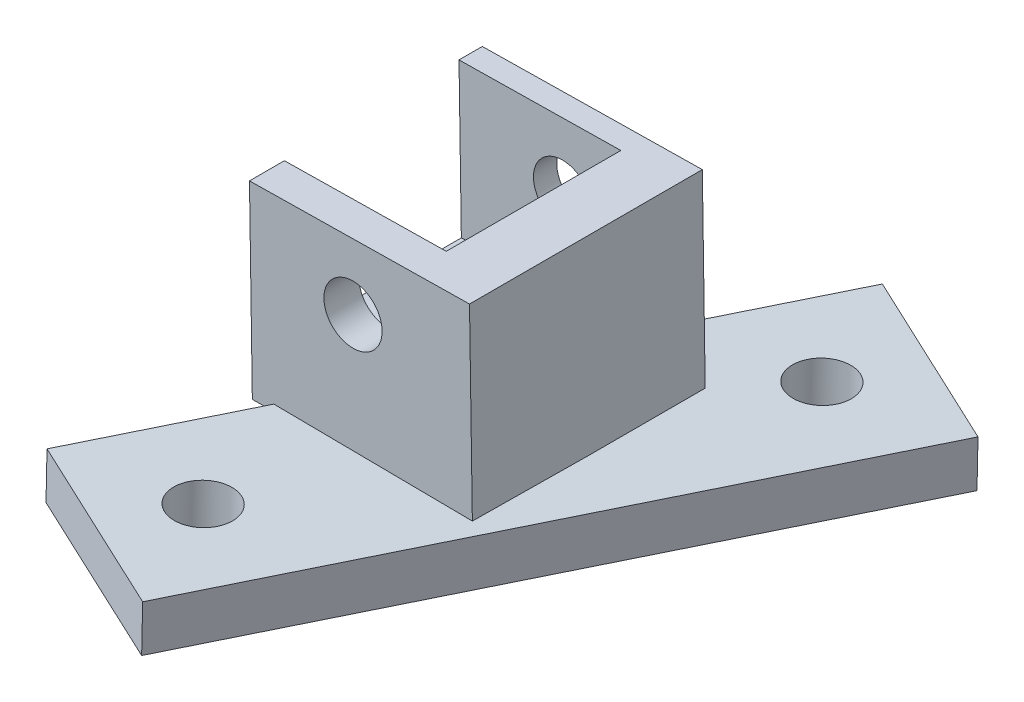
ISO-10303-21;
HEADER;
FILE_DESCRIPTION(('STEP AP214'),'2;1');
FILE_NAME('part.step','',(''),(''),'','','');
FILE_SCHEMA(('AUTOMOTIVE_DESIGN { 1 0 10303 214 1 1 1 1 }'));
ENDSEC;
DATA;
#1=APPLICATION_CONTEXT('core data for automotive mechanical design processes');
#2=APPLICATION_PROTOCOL_DEFINITION('international standard','automotive_design',2000,#1);
#3=PRODUCT_CONTEXT('',#1,'mechanical');
#4=PRODUCT('Part','Part','',(#3));
#5=PRODUCT_RELATED_PRODUCT_CATEGORY('part','',(#4));
#6=PRODUCT_DEFINITION_FORMATION('','',#4);
#7=PRODUCT_DEFINITION_CONTEXT('part definition',#1,'design');
#8=PRODUCT_DEFINITION('design','',#6,#7);
#9=PRODUCT_DEFINITION_SHAPE('','',#8);
#10=(LENGTH_UNIT() NAMED_UNIT(*) SI_UNIT(.MILLI.,.METRE.));
#11=(NAMED_UNIT(*) PLANE_ANGLE_UNIT() SI_UNIT($,.RADIAN.));
#12=(NAMED_UNIT(*) SI_UNIT($,.STERADIAN.) SOLID_ANGLE_UNIT());
#13=UNCERTAINTY_MEASURE_WITH_UNIT(LENGTH_MEASURE(1.E-05),#10,'distance_accuracy_value','');
#14=(GEOMETRIC_REPRESENTATION_CONTEXT(3) GLOBAL_UNCERTAINTY_ASSIGNED_CONTEXT((#13)) GLOBAL_UNIT_ASSIGNED_CONTEXT((#10,
#11,#12)) REPRESENTATION_CONTEXT('',''));
#15=CARTESIAN_POINT('',(0.,0.,0.));
#16=DIRECTION('',(0.,0.,1.));
#17=DIRECTION('',(1.,0.,0.));
#18=AXIS2_PLACEMENT_3D('',#15,#16,#17);
#19=CARTESIAN_POINT('',(-1.23244160219365,80.7225949257515,-21.59));
#20=DIRECTION('',(0.0152658371215673,-0.999883470318906,0.));
#21=DIRECTION('',(0.999883470318906,0.0152658371215673,0.));
#22=AXIS2_PLACEMENT_3D('',#19,#20,#21);
#23=PLANE('',#22);
#24=DIRECTION('',(0.422875145041343,0.00645629543700863,-0.906164956260996));
#25=VECTOR('',#24,1.);
#26=CARTESIAN_POINT('',(518.000775587495,88.6500484311055,220.77426546163));
#27=LINE('',#26,#25);
#28=CARTESIAN_POINT('',(619.250326888229,90.1958877260544,3.81));
#29=VERTEX_POINT('',#28);
#30=CARTESIAN_POINT('',(631.103608798809,90.3768590855921,-21.59));
#31=VERTEX_POINT('',#30);
#32=EDGE_CURVE('E204',#29,#31,#27,.T.);
#33=ORIENTED_EDGE('',*,*,#32,.F.);
#34=DIRECTION('',(0.999883470318906,0.0152658371215673,0.));
#35=VECTOR('',#34,1.);
#36=CARTESIAN_POINT('',(-1.23244160219365,80.7225949257514,3.81));
#37=LINE('',#36,#35);
#38=CARTESIAN_POINT('',(616.909080854011,90.1601424800523,3.81));
#39=VERTEX_POINT('',#38);
#40=EDGE_CURVE('E213',#39,#29,#37,.T.);
#41=ORIENTED_EDGE('',*,*,#40,.F.);
#42=DIRECTION('',(0.,0.,1.));
#43=VECTOR('',#42,1.);
#44=CARTESIAN_POINT('',(616.909080854011,90.1601424800523,-21.59));
#45=LINE('',#44,#43);
#46=CARTESIAN_POINT('',(616.909080854011,90.1601424800523,-21.59));
#47=VERTEX_POINT('',#46);
#48=EDGE_CURVE('E280',#47,#39,#45,.T.);
#49=ORIENTED_EDGE('',*,*,#48,.F.);
#50=DIRECTION('',(0.999883470318906,0.0152658371215673,0.));
#51=VECTOR('',#50,1.);
#52=CARTESIAN_POINT('',(-1.23244160219365,80.7225949257515,-21.59));
#53=LINE('',#52,#51);
#54=EDGE_CURVE('E258',#47,#31,#53,.T.);
#55=ORIENTED_EDGE('',*,*,#54,.T.);
#56=EDGE_LOOP('',(#33,#41,#49,#55));
#57=FACE_BOUND('',#56,.T.);
#58=ADVANCED_FACE('F41',(#57),#23,.T.);
#59=CARTESIAN_POINT('',(627.893070479448,103.664395922966,-21.59));
#60=DIRECTION('',(0.,0.,1.));
#61=DIRECTION('',(1.,0.,0.));
#62=AXIS2_PLACEMENT_3D('',#59,#60,#61);
#63=CYLINDRICAL_SURFACE('',#62,9.65200000000004);
#64=CARTESIAN_POINT('',(627.893070479448,103.664395922966,-19.0500000000001));
#65=DIRECTION('',(0.,0.,-1.));
#66=DIRECTION('',(-1.,0.,0.));
#67=AXIS2_PLACEMENT_3D('',#64,#65,#66);
#68=CIRCLE('',#67,9.65200000000005);
#69=CARTESIAN_POINT('',(634.25254540357,110.925124721748,-19.0500000000001));
#70=VERTEX_POINT('',#69);
#71=CARTESIAN_POINT('',(629.598897848949,94.1643297660671,-19.0500000000001));
#72=VERTEX_POINT('',#71);
#73=EDGE_CURVE('E234',#70,#72,#68,.T.);
#74=ORIENTED_EDGE('',*,*,#73,.T.);
#75=DIRECTION('',(0.,0.,1.));
#76=VECTOR('',#75,1.);
#77=CARTESIAN_POINT('',(629.598897848949,94.164329766067,-21.59));
#78=LINE('',#77,#76);
#79=CARTESIAN_POINT('',(629.598897848949,94.164329766067,0.));
#80=VERTEX_POINT('',#79);
#81=EDGE_CURVE('E267',#72,#80,#78,.T.);
#82=ORIENTED_EDGE('',*,*,#81,.T.);
#83=CARTESIAN_POINT('',(627.893070479448,103.664395922966,0.));
#84=DIRECTION('',(0.,0.,1.));
#85=DIRECTION('',(1.,0.,0.));
#86=AXIS2_PLACEMENT_3D('',#83,#84,#85);
#87=CIRCLE('',#86,9.65200000000004);
#88=CARTESIAN_POINT('',(634.25254540357,110.925124721748,0.));
#89=VERTEX_POINT('',#88);
#90=EDGE_CURVE('E252',#80,#89,#87,.T.);
#91=ORIENTED_EDGE('',*,*,#90,.T.);
#92=DIRECTION('',(0.,0.,1.));
#93=VECTOR('',#92,1.);
#94=CARTESIAN_POINT('',(634.25254540357,110.925124721748,-21.59));
#95=LINE('',#94,#93);
#96=EDGE_CURVE('E272',#70,#89,#95,.T.);
#97=ORIENTED_EDGE('',*,*,#96,.F.);
#98=EDGE_LOOP('',(#74,#82,#91,#97));
#99=FACE_BOUND('',#98,.T.);
#100=ADVANCED_FACE('F43',(#99),#63,.F.);
#101=CARTESIAN_POINT('',(-1.29060444162686,84.5321509476662,-21.59));
#102=DIRECTION('',(0.0152658371215678,-0.999883470318906,0.));
#103=DIRECTION('',(0.999883470318906,0.0152658371215678,0.));
#104=AXIS2_PLACEMENT_3D('',#101,#102,#103);
#105=PLANE('',#104);
#106=DIRECTION('',(-0.999883470318905,-0.0152658371215683,0.));
#107=VECTOR('',#106,1.);
#108=CARTESIAN_POINT('',(616.850918014578,93.9696985019674,-19.0500000000001));
#109=LINE('',#108,#107);
#110=CARTESIAN_POINT('',(616.850918014578,93.9696985019674,-19.0500000000001));
#111=VERTEX_POINT('',#110);
#112=EDGE_CURVE('E244',#72,#111,#109,.T.);
#113=ORIENTED_EDGE('',*,*,#112,.T.);
#114=DIRECTION('',(0.,0.,1.));
#115=VECTOR('',#114,1.);
#116=CARTESIAN_POINT('',(616.850918014578,93.9696985019674,-21.59));
#117=LINE('',#116,#115);
#118=CARTESIAN_POINT('',(616.850918014578,93.9696985019674,0.));
#119=VERTEX_POINT('',#118);
#120=EDGE_CURVE('E282',#111,#119,#117,.T.);
#121=ORIENTED_EDGE('',*,*,#120,.T.);
#122=DIRECTION('',(0.999883470318906,0.0152658371215678,0.));
#123=VECTOR('',#122,1.);
#124=CARTESIAN_POINT('',(-1.29060444162686,84.5321509476662,0.));
#125=LINE('',#124,#123);
#126=EDGE_CURVE('E257',#119,#80,#125,.T.);
#127=ORIENTED_EDGE('',*,*,#126,.T.);
#128=ORIENTED_EDGE('',*,*,#81,.F.);
#129=EDGE_LOOP('',(#113,#121,#127,#128));
#130=FACE_BOUND('',#129,.T.);
#131=ADVANCED_FACE('F327',(#130),#105,.F.);
#132=CARTESIAN_POINT('',(-1.54535767834422,101.218006323654,-21.59));
#133=DIRECTION('',(-0.0152658371215685,0.999883470318906,0.));
#134=DIRECTION('',(-0.999883470318906,-0.0152658371215685,0.));
#135=AXIS2_PLACEMENT_3D('',#132,#133,#134);
#136=PLANE('',#135);
#137=ORIENTED_EDGE('',*,*,#96,.T.);
#138=DIRECTION('',(0.999883470318906,0.0152658371215686,0.));
#139=VECTOR('',#138,1.);
#140=CARTESIAN_POINT('',(-1.54535767834423,101.218006323654,0.));
#141=LINE('',#140,#139);
#142=CARTESIAN_POINT('',(616.596164777861,110.655553877955,0.));
#143=VERTEX_POINT('',#142);
#144=EDGE_CURVE('E228',#143,#89,#141,.T.);
#145=ORIENTED_EDGE('',*,*,#144,.F.);
#146=DIRECTION('',(0.,0.,-1.));
#147=VECTOR('',#146,1.);
#148=CARTESIAN_POINT('',(616.596164777861,110.655553877955,3.81));
#149=LINE('',#148,#147);
#150=CARTESIAN_POINT('',(616.596164777861,110.655553877955,3.81));
#151=VERTEX_POINT('',#150);
#152=EDGE_CURVE('E225',#151,#143,#149,.T.);
#153=ORIENTED_EDGE('',*,*,#152,.F.);
#154=DIRECTION('',(0.999883470318906,0.0152658371215686,0.));
#155=VECTOR('',#154,1.);
#156=CARTESIAN_POINT('',(-1.54535767834423,101.218006323654,3.81));
#157=LINE('',#156,#155);
#158=CARTESIAN_POINT('',(640.601805440096,111.02206278747,3.81));
#159=VERTEX_POINT('',#158);
#160=EDGE_CURVE('E219',#151,#159,#157,.T.);
#161=ORIENTED_EDGE('',*,*,#160,.T.);
#162=DIRECTION('',(0.,0.,1.));
#163=VECTOR('',#162,1.);
#164=CARTESIAN_POINT('',(640.601805440096,111.02206278747,-21.59));
#165=LINE('',#164,#163);
#166=CARTESIAN_POINT('',(640.601805440096,111.02206278747,-21.59));
#167=VERTEX_POINT('',#166);
#168=EDGE_CURVE('E275',#167,#159,#165,.T.);
#169=ORIENTED_EDGE('',*,*,#168,.F.);
#170=DIRECTION('',(-0.999883470318906,-0.0152658371215685,0.));
#171=VECTOR('',#170,1.);
#172=CARTESIAN_POINT('',(-1.54535767834422,101.218006323654,-21.59));
#173=LINE('',#172,#171);
#174=CARTESIAN_POINT('',(616.596164777861,110.655553877955,-21.59));
#175=VERTEX_POINT('',#174);
#176=EDGE_CURVE('E264',#167,#175,#173,.T.);
#177=ORIENTED_EDGE('',*,*,#176,.T.);
#178=DIRECTION('',(0.,0.,1.));
#179=VECTOR('',#178,1.);
#180=CARTESIAN_POINT('',(616.596164777861,110.655553877955,-48.5407537628993));
#181=LINE('',#180,#179);
#182=CARTESIAN_POINT('',(616.596164777861,110.655553877955,-19.0500000000001));
#183=VERTEX_POINT('',#182);
#184=EDGE_CURVE('E240',#175,#183,#181,.T.);
#185=ORIENTED_EDGE('',*,*,#184,.T.);
#186=DIRECTION('',(0.999883470318906,0.0152658371215679,0.));
#187=VECTOR('',#186,1.);
#188=CARTESIAN_POINT('',(616.596164777861,110.655553877955,-19.0500000000001));
#189=LINE('',#188,#187);
#190=EDGE_CURVE('E238',#183,#70,#189,.T.);
#191=ORIENTED_EDGE('',*,*,#190,.T.);
#192=EDGE_LOOP('',(#137,#145,#153,#161,#169,#177,#185,#191));
#193=FACE_BOUND('',#192,.T.);
#194=ADVANCED_FACE('F309',(#193),#136,.T.);
#195=CARTESIAN_POINT('',(642.14716311844,9.80405646381604,-21.59));
#196=DIRECTION('',(0.999883470318906,0.0152658371215677,0.));
#197=DIRECTION('',(-0.0152658371215677,0.999883470318906,0.));
#198=AXIS2_PLACEMENT_3D('',#195,#196,#197);
#199=PLANE('',#198);
#200=DIRECTION('',(-0.000170947301251259,0.0111967250440051,0.999937300097016));
#201=VECTOR('',#200,1.);
#202=CARTESIAN_POINT('',(640.917046953941,90.3743396169369,-22.4923901719979));
#203=LINE('',#202,#201);
#204=CARTESIAN_POINT('',(640.914721516246,90.5266513895672,-8.89000000001026));
#205=VERTEX_POINT('',#204);
#206=CARTESIAN_POINT('',(640.912550349388,90.6688587140117,3.81));
#207=VERTEX_POINT('',#206);
#208=EDGE_CURVE('E56',#205,#207,#203,.T.);
#209=ORIENTED_EDGE('',*,*,#208,.F.);
#210=DIRECTION('',(0.,0.,1.));
#211=VECTOR('',#210,1.);
#212=CARTESIAN_POINT('',(640.914721516246,90.5266513895672,-21.59));
#213=LINE('',#212,#211);
#214=CARTESIAN_POINT('',(640.914721516246,90.5266513895672,-21.59));
#215=VERTEX_POINT('',#214);
#216=EDGE_CURVE('E278',#215,#205,#213,.T.);
#217=ORIENTED_EDGE('',*,*,#216,.F.);
#218=DIRECTION('',(-0.0152658371215677,0.999883470318906,0.));
#219=VECTOR('',#218,1.);
#220=CARTESIAN_POINT('',(642.14716311844,9.80405646381604,-21.59));
#221=LINE('',#220,#219);
#222=EDGE_CURVE('E261',#215,#167,#221,.T.);
#223=ORIENTED_EDGE('',*,*,#222,.T.);
#224=ORIENTED_EDGE('',*,*,#168,.T.);
#225=DIRECTION('',(-0.0152658371215677,0.999883470318906,0.));
#226=VECTOR('',#225,1.);
#227=CARTESIAN_POINT('',(642.14716311844,9.80405646381604,3.81));
#228=LINE('',#227,#226);
#229=EDGE_CURVE('E217',#207,#159,#228,.T.);
#230=ORIENTED_EDGE('',*,*,#229,.F.);
#231=EDGE_LOOP('',(#209,#217,#223,#224,#230));
#232=FACE_BOUND('',#231,.T.);
#233=ADVANCED_FACE('F310',(#232),#199,.T.);
#234=DIRECTION('',(0.400047773889432,0.00610777589421882,0.916473935079299));
#235=VECTOR('',#234,1.);
#236=CARTESIAN_POINT('',(533.466432764038,88.8861721499623,-255.044490632146));
#237=LINE('',#236,#235);
#238=CARTESIAN_POINT('',(635.371075882776,90.4420131353982,-21.59));
#239=VERTEX_POINT('',#238);
#240=EDGE_CURVE('E200',#239,#205,#237,.T.);
#241=ORIENTED_EDGE('',*,*,#240,.F.);
#242=EDGE_CURVE('E256',#239,#215,#53,.T.);
#243=ORIENTED_EDGE('',*,*,#242,.T.);
#244=ORIENTED_EDGE('',*,*,#216,.T.);
#245=EDGE_LOOP('',(#241,#243,#244));
#246=FACE_BOUND('',#245,.T.);
#247=ADVANCED_FACE('F312',(#246),#23,.T.);
#248=CARTESIAN_POINT('',(618.141522456205,9.43754755430115,-21.59));
#249=DIRECTION('',(-0.999883470318906,-0.0152658371215677,0.));
#250=DIRECTION('',(0.0152658371215677,-0.999883470318906,0.));
#251=AXIS2_PLACEMENT_3D('',#248,#249,#250);
#252=PLANE('',#251);
#253=ORIENTED_EDGE('',*,*,#48,.T.);
#254=DIRECTION('',(0.0152658371215623,-0.999883470318906,0.));
#255=VECTOR('',#254,1.);
#256=CARTESIAN_POINT('',(618.141522456205,9.43754755429778,3.81));
#257=LINE('',#256,#255);
#258=EDGE_CURVE('E210',#151,#39,#257,.T.);
#259=ORIENTED_EDGE('',*,*,#258,.F.);
#260=ORIENTED_EDGE('',*,*,#152,.T.);
#261=DIRECTION('',(0.0152658371215623,-0.999883470318906,0.));
#262=VECTOR('',#261,1.);
#263=CARTESIAN_POINT('',(618.141522456205,9.43754755429778,0.));
#264=LINE('',#263,#262);
#265=EDGE_CURVE('E209',#143,#119,#264,.T.);
#266=ORIENTED_EDGE('',*,*,#265,.T.);
#267=ORIENTED_EDGE('',*,*,#120,.F.);
#268=DIRECTION('',(-0.0152658371215684,0.999883470318906,0.));
#269=VECTOR('',#268,1.);
#270=CARTESIAN_POINT('',(616.850918014578,93.9696985019674,-19.0500000000001));
#271=LINE('',#270,#269);
#272=EDGE_CURVE('E241',#111,#183,#271,.T.);
#273=ORIENTED_EDGE('',*,*,#272,.T.);
#274=ORIENTED_EDGE('',*,*,#184,.F.);
#275=DIRECTION('',(0.0152658371215677,-0.999883470318906,0.));
#276=VECTOR('',#275,1.);
#277=CARTESIAN_POINT('',(618.141522456205,9.43754755430115,-21.59));
#278=LINE('',#277,#276);
#279=EDGE_CURVE('E253',#175,#47,#278,.T.);
#280=ORIENTED_EDGE('',*,*,#279,.T.);
#281=EDGE_LOOP('',(#253,#259,#260,#266,#267,#273,#274,#280));
#282=FACE_BOUND('',#281,.T.);
#283=ADVANCED_FACE('F303',(#282),#252,.T.);
#284=CARTESIAN_POINT('',(0.,0.,-21.59));
#285=DIRECTION('',(0.,0.,1.));
#286=DIRECTION('',(1.,0.,0.));
#287=AXIS2_PLACEMENT_3D('',#284,#285,#286);
#288=PLANE('',#287);
#289=DIRECTION('',(-0.999946125618088,0.0103800703935442,0.));
#290=VECTOR('',#289,1.);
#291=CARTESIAN_POINT('',(1.00720248977156,97.0271095643389,-21.59));
#292=LINE('',#291,#290);
#293=CARTESIAN_POINT('',(631.104173155107,90.4863062723392,-21.59));
#294=VERTEX_POINT('',#293);
#295=EDGE_CURVE('E64',#239,#294,#292,.T.);
#296=ORIENTED_EDGE('',*,*,#295,.T.);
#297=DIRECTION('',(-0.00515635725489893,-0.999986705901563,0.));
#298=VECTOR('',#297,1.);
#299=CARTESIAN_POINT('',(630.620819825581,-3.25174946847547,-21.59));
#300=LINE('',#299,#298);
#301=EDGE_CURVE('E207',#294,#31,#300,.T.);
#302=ORIENTED_EDGE('',*,*,#301,.T.);
#303=ORIENTED_EDGE('',*,*,#54,.F.);
#304=ORIENTED_EDGE('',*,*,#279,.F.);
#305=ORIENTED_EDGE('',*,*,#176,.F.);
#306=ORIENTED_EDGE('',*,*,#222,.F.);
#307=ORIENTED_EDGE('',*,*,#242,.F.);
#308=EDGE_LOOP('',(#296,#302,#303,#304,#305,#306,#307));
#309=FACE_BOUND('',#308,.T.);
#310=CARTESIAN_POINT('',(627.893070479448,103.664395922966,-21.59));
#311=DIRECTION('',(0.,0.,1.));
#312=DIRECTION('',(1.,0.,0.));
#313=AXIS2_PLACEMENT_3D('',#310,#311,#312);
#314=CIRCLE('',#313,3.17500000000009);
#315=CARTESIAN_POINT('',(631.068070479448,103.664395922966,-21.59));
#316=VERTEX_POINT('',#315);
#317=EDGE_CURVE('E237',#316,#316,#314,.T.);
#318=ORIENTED_EDGE('',*,*,#317,.T.);
#319=EDGE_LOOP('',(#318));
#320=FACE_BOUND('',#319,.T.);
#321=ADVANCED_FACE('F297',(#309,#320),#288,.F.);
#322=CARTESIAN_POINT('',(627.893070479448,103.664395922966,-19.0500000000001));
#323=DIRECTION('',(0.,0.,-1.));
#324=DIRECTION('',(-1.,0.,0.));
#325=AXIS2_PLACEMENT_3D('',#322,#323,#324);
#326=PLANE('',#325);
#327=ORIENTED_EDGE('',*,*,#112,.F.);
#328=ORIENTED_EDGE('',*,*,#73,.F.);
#329=ORIENTED_EDGE('',*,*,#190,.F.);
#330=ORIENTED_EDGE('',*,*,#272,.F.);
#331=EDGE_LOOP('',(#327,#328,#329,#330));
#332=FACE_BOUND('',#331,.T.);
#333=CARTESIAN_POINT('',(627.893070479448,103.664395922966,-19.0500000000001));
#334=DIRECTION('',(0.,0.,-1.));
#335=DIRECTION('',(-1.,0.,0.));
#336=AXIS2_PLACEMENT_3D('',#333,#334,#335);
#337=CIRCLE('',#336,3.17500000000009);
#338=CARTESIAN_POINT('',(624.718070479448,103.664395922966,-19.0500000000001));
#339=VERTEX_POINT('',#338);
#340=EDGE_CURVE('E233',#339,#339,#337,.T.);
#341=ORIENTED_EDGE('',*,*,#340,.T.);
#342=EDGE_LOOP('',(#341));
#343=FACE_BOUND('',#342,.T.);
#344=ADVANCED_FACE('F345',(#332,#343),#326,.F.);
#345=CARTESIAN_POINT('',(627.893070479448,103.664395922966,-48.5407537628993));
#346=DIRECTION('',(0.,0.,1.));
#347=DIRECTION('',(1.,0.,0.));
#348=AXIS2_PLACEMENT_3D('',#345,#346,#347);
#349=CYLINDRICAL_SURFACE('',#348,3.17500000000009);
#350=ORIENTED_EDGE('',*,*,#317,.F.);
#351=EDGE_LOOP('',(#350));
#352=FACE_BOUND('',#351,.T.);
#353=ORIENTED_EDGE('',*,*,#340,.F.);
#354=EDGE_LOOP('',(#353));
#355=FACE_BOUND('',#354,.T.);
#356=ADVANCED_FACE('F348',(#352,#355),#349,.F.);
#357=CARTESIAN_POINT('',(627.893070479448,103.664395922966,3.81));
#358=DIRECTION('',(0.,0.,-1.));
#359=DIRECTION('',(-1.,0.,0.));
#360=AXIS2_PLACEMENT_3D('',#357,#358,#359);
#361=CYLINDRICAL_SURFACE('',#360,3.17499999999997);
#362=CARTESIAN_POINT('',(627.893070479448,103.664395922966,3.81));
#363=DIRECTION('',(0.,0.,1.));
#364=DIRECTION('',(1.,0.,0.));
#365=AXIS2_PLACEMENT_3D('',#362,#363,#364);
#366=CIRCLE('',#365,3.17499999999997);
#367=CARTESIAN_POINT('',(624.718070479448,103.664395922966,3.81));
#368=VERTEX_POINT('',#367);
#369=EDGE_CURVE('E222',#368,#368,#366,.T.);
#370=CARTESIAN_POINT('',(627.893070479448,103.664395922966,0.));
#371=DIRECTION('',(0.,0.,1.));
#372=DIRECTION('',(1.,0.,0.));
#373=AXIS2_PLACEMENT_3D('',#370,#371,#372);
#374=CIRCLE('',#373,3.17499999999997);
#375=CARTESIAN_POINT('',(624.718070479448,103.664395922966,0.));
#376=VERTEX_POINT('',#375);
#377=EDGE_CURVE('E214',#376,#376,#374,.T.);
#378=CARTESIAN_POINT('',(624.718070479448,103.664395922966,3.81));
#379=CARTESIAN_POINT('',(624.718070479448,103.664395922966,3.7703125));
#380=CARTESIAN_POINT('',(624.718070479448,103.664395922966,3.730625));
#381=CARTESIAN_POINT('',(624.718070479448,103.664395922966,3.65125));
#382=CARTESIAN_POINT('',(624.718070479448,103.664395922966,3.6115625));
#383=CARTESIAN_POINT('',(624.718070479448,103.664395922966,3.5321875));
#384=CARTESIAN_POINT('',(624.718070479448,103.664395922966,3.4925));
#385=CARTESIAN_POINT('',(624.718070479448,103.664395922966,3.413125));
#386=CARTESIAN_POINT('',(624.718070479448,103.664395922966,3.3734375));
#387=CARTESIAN_POINT('',(624.718070479448,103.664395922966,3.2940625));
#388=CARTESIAN_POINT('',(624.718070479448,103.664395922966,3.254375));
#389=CARTESIAN_POINT('',(624.718070479448,103.664395922966,3.175));
#390=CARTESIAN_POINT('',(624.718070479448,103.664395922966,3.1353125));
#391=CARTESIAN_POINT('',(624.718070479448,103.664395922966,3.0559375));
#392=CARTESIAN_POINT('',(624.718070479448,103.664395922966,3.01625));
#393=CARTESIAN_POINT('',(624.718070479448,103.664395922966,2.936875));
#394=CARTESIAN_POINT('',(624.718070479448,103.664395922966,2.8971875));
#395=CARTESIAN_POINT('',(624.718070479448,103.664395922966,2.8178125));
#396=CARTESIAN_POINT('',(624.718070479448,103.664395922966,2.778125));
#397=CARTESIAN_POINT('',(624.718070479448,103.664395922966,2.69875));
#398=CARTESIAN_POINT('',(624.718070479448,103.664395922966,2.6590625));
#399=CARTESIAN_POINT('',(624.718070479448,103.664395922966,2.5796875));
#400=CARTESIAN_POINT('',(624.718070479448,103.664395922966,2.54));
#401=CARTESIAN_POINT('',(624.718070479448,103.664395922966,2.460625));
#402=CARTESIAN_POINT('',(624.718070479448,103.664395922966,2.4209375));
#403=CARTESIAN_POINT('',(624.718070479448,103.664395922966,2.3415625));
#404=CARTESIAN_POINT('',(624.718070479448,103.664395922966,2.301875));
#405=CARTESIAN_POINT('',(624.718070479448,103.664395922966,2.2225));
#406=CARTESIAN_POINT('',(624.718070479448,103.664395922966,2.1828125));
#407=CARTESIAN_POINT('',(624.718070479448,103.664395922966,2.1034375));
#408=CARTESIAN_POINT('',(624.718070479448,103.664395922966,2.06375));
#409=CARTESIAN_POINT('',(624.718070479448,103.664395922966,1.984375));
#410=CARTESIAN_POINT('',(624.718070479448,103.664395922966,1.9446875));
#411=CARTESIAN_POINT('',(624.718070479448,103.664395922966,1.8653125));
#412=CARTESIAN_POINT('',(624.718070479448,103.664395922966,1.825625));
#413=CARTESIAN_POINT('',(624.718070479448,103.664395922966,1.74625));
#414=CARTESIAN_POINT('',(624.718070479448,103.664395922966,1.7065625));
#415=CARTESIAN_POINT('',(624.718070479448,103.664395922966,1.6271875));
#416=CARTESIAN_POINT('',(624.718070479448,103.664395922966,1.5875));
#417=CARTESIAN_POINT('',(624.718070479448,103.664395922966,1.508125));
#418=CARTESIAN_POINT('',(624.718070479448,103.664395922966,1.4684375));
#419=CARTESIAN_POINT('',(624.718070479448,103.664395922966,1.3890625));
#420=CARTESIAN_POINT('',(624.718070479448,103.664395922966,1.349375));
#421=CARTESIAN_POINT('',(624.718070479448,103.664395922966,1.27));
#422=CARTESIAN_POINT('',(624.718070479448,103.664395922966,1.2303125));
#423=CARTESIAN_POINT('',(624.718070479448,103.664395922966,1.1509375));
#424=CARTESIAN_POINT('',(624.718070479448,103.664395922966,1.11125));
#425=CARTESIAN_POINT('',(624.718070479448,103.664395922966,1.031875));
#426=CARTESIAN_POINT('',(624.718070479448,103.664395922966,0.9921875));
#427=CARTESIAN_POINT('',(624.718070479448,103.664395922966,0.9128125));
#428=CARTESIAN_POINT('',(624.718070479448,103.664395922966,0.873125));
#429=CARTESIAN_POINT('',(624.718070479448,103.664395922966,0.79375));
#430=CARTESIAN_POINT('',(624.718070479448,103.664395922966,0.7540625));
#431=CARTESIAN_POINT('',(624.718070479448,103.664395922966,0.6746875));
#432=CARTESIAN_POINT('',(624.718070479448,103.664395922966,0.635));
#433=CARTESIAN_POINT('',(624.718070479448,103.664395922966,0.555625));
#434=CARTESIAN_POINT('',(624.718070479448,103.664395922966,0.5159375));
#435=CARTESIAN_POINT('',(624.718070479448,103.664395922966,0.4365625));
#436=CARTESIAN_POINT('',(624.718070479448,103.664395922966,0.396875));
#437=CARTESIAN_POINT('',(624.718070479448,103.664395922966,0.3175));
#438=CARTESIAN_POINT('',(624.718070479448,103.664395922966,0.2778125));
#439=CARTESIAN_POINT('',(624.718070479448,103.664395922966,0.1984375));
#440=CARTESIAN_POINT('',(624.718070479448,103.664395922966,0.15875));
#441=CARTESIAN_POINT('',(624.718070479448,103.664395922966,0.0793749999999999));
#442=CARTESIAN_POINT('',(624.718070479448,103.664395922966,0.0396874999999999));
#443=CARTESIAN_POINT('',(624.718070479448,103.664395922966,0.));
#444=B_SPLINE_CURVE_WITH_KNOTS('',3,(#378,#379,#380,#381,#382,#383,#384,#385,#386,#387,#388,
#389,#390,#391,#392,#393,#394,#395,#396,#397,#398,#399,#400,#401,#402,#403,#404,#405,#406,#407,
#408,#409,#410,#411,#412,#413,#414,#415,#416,#417,#418,#419,#420,#421,#422,#423,#424,#425,#426,
#427,#428,#429,#430,#431,#432,#433,#434,#435,#436,#437,#438,#439,#440,#441,#442,#443),
.UNSPECIFIED.,.F.,.F.,(4,2,2,2,2,2,2,2,2,2,2,2,2,2,2,2,2,2,2,2,2,2,2,2,2,2,2,2,2,2,2,2,4),(0.,
0.1190625,0.238125,0.3571875,0.47625,0.595312499999999,0.714375,0.833437499999999,
0.952499999999999,1.0715625,1.190625,1.3096875,1.42875,1.5478125,1.666875,1.7859375,1.905,
2.0240625,2.143125,2.2621875,2.38125,2.5003125,2.619375,2.7384375,2.8575,2.9765625,3.095625,
3.2146875,3.33375,3.4528125,3.571875,3.6909375,3.81),.UNSPECIFIED.);
#445=EDGE_CURVE('BSEAM352',#368,#376,#444,.T.);
#446=ORIENTED_EDGE('',*,*,#369,.T.);
#447=ORIENTED_EDGE('',*,*,#377,.F.);
#448=ORIENTED_EDGE('',*,*,#445,.T.);
#449=ORIENTED_EDGE('',*,*,#445,.F.);
#450=EDGE_LOOP('',(#446,#448,#447,#449));
#451=FACE_BOUND('',#450,.T.);
#452=ADVANCED_FACE('F352',(#451),#361,.F.);
#453=CARTESIAN_POINT('',(0.,0.,3.81));
#454=DIRECTION('',(0.,0.,1.));
#455=DIRECTION('',(1.,0.,0.));
#456=AXIS2_PLACEMENT_3D('',#453,#454,#455);
#457=PLANE('',#456);
#458=DIRECTION('',(-0.00515635725489893,-0.999986705901563,0.));
#459=VECTOR('',#458,1.);
#460=CARTESIAN_POINT('',(618.768786210877,-3.1906353365037,3.81));
#461=LINE('',#460,#459);
#462=CARTESIAN_POINT('',(619.253925048116,90.8936888818526,3.80999999999999));
#463=VERTEX_POINT('',#462);
#464=EDGE_CURVE('E11',#463,#29,#461,.T.);
#465=ORIENTED_EDGE('',*,*,#464,.F.);
#466=DIRECTION('',(-0.999946125618088,0.0103800703935442,0.));
#467=VECTOR('',#466,1.);
#468=CARTESIAN_POINT('',(1.01015410692916,97.3114484974248,3.81));
#469=LINE('',#468,#467);
#470=EDGE_CURVE('E49',#207,#463,#469,.T.);
#471=ORIENTED_EDGE('',*,*,#470,.F.);
#472=ORIENTED_EDGE('',*,*,#229,.T.);
#473=ORIENTED_EDGE('',*,*,#160,.F.);
#474=ORIENTED_EDGE('',*,*,#258,.T.);
#475=ORIENTED_EDGE('',*,*,#40,.T.);
#476=EDGE_LOOP('',(#465,#471,#472,#473,#474,#475));
#477=FACE_BOUND('',#476,.T.);
#478=ORIENTED_EDGE('',*,*,#369,.F.);
#479=EDGE_LOOP('',(#478));
#480=FACE_BOUND('',#479,.T.);
#481=ADVANCED_FACE('F358',(#477,#480),#457,.T.);
#482=CARTESIAN_POINT('',(0.,0.,0.));
#483=DIRECTION('',(0.,0.,1.));
#484=DIRECTION('',(1.,0.,0.));
#485=AXIS2_PLACEMENT_3D('',#482,#483,#484);
#486=PLANE('',#485);
#487=ORIENTED_EDGE('',*,*,#90,.F.);
#488=ORIENTED_EDGE('',*,*,#126,.F.);
#489=ORIENTED_EDGE('',*,*,#265,.F.);
#490=ORIENTED_EDGE('',*,*,#144,.T.);
#491=EDGE_LOOP('',(#487,#488,#489,#490));
#492=FACE_BOUND('',#491,.T.);
#493=ORIENTED_EDGE('',*,*,#377,.T.);
#494=EDGE_LOOP('',(#493));
#495=FACE_BOUND('',#494,.T.);
#496=ADVANCED_FACE('F342',(#492,#495),#486,.F.);
#497=CARTESIAN_POINT('',(640.321021092914,85.0882328634645,-41.4016800053749));
#498=DIRECTION('',(-0.90618670768909,0.00467268452361364,-0.422852003456234));
#499=DIRECTION('',(-0.422856619803061,0.,0.906196600682616));
#500=AXIS2_PLACEMENT_3D('',#497,#498,#499);
#501=PLANE('',#500);
#502=ORIENTED_EDGE('',*,*,#301,.F.);
#503=DIRECTION('',(-0.422750420991199,0.0145331277557527,0.906129609796192));
#504=VECTOR('',#503,1.);
#505=CARTESIAN_POINT('',(640.373748546473,90.1676408926846,-41.4585472924219));
#506=LINE('',#505,#504);
#507=CARTESIAN_POINT('',(640.373748546473,90.1676408926846,-41.4585472924219));
#508=VERTEX_POINT('',#507);
#509=EDGE_CURVE('E177',#508,#294,#506,.T.);
#510=ORIENTED_EDGE('',*,*,#509,.F.);
#511=DIRECTION('',(0.0103794199920882,0.999883470318906,-0.0111943478438939));
#512=VECTOR('',#511,1.);
#513=CARTESIAN_POINT('',(640.321021092914,85.0882328634645,-41.4016800053749));
#514=LINE('',#513,#512);
#515=CARTESIAN_POINT('',(640.321021092914,85.0882328634645,-41.4016800053749));
#516=VERTEX_POINT('',#515);
#517=EDGE_CURVE('E196',#516,#508,#514,.T.);
#518=ORIENTED_EDGE('',*,*,#517,.F.);
#519=DIRECTION('',(-0.422750420991199,0.0145331277557527,0.906129609796192));
#520=VECTOR('',#519,1.);
#521=CARTESIAN_POINT('',(640.321021092914,85.0882328634645,-41.4016800053749));
#522=LINE('',#521,#520);
#523=CARTESIAN_POINT('',(611.328797221337,86.084914764954,20.7406886344479));
#524=VERTEX_POINT('',#523);
#525=EDGE_CURVE('E162',#516,#524,#522,.T.);
#526=ORIENTED_EDGE('',*,*,#525,.T.);
#527=DIRECTION('',(0.0103794199920882,0.999883470318906,-0.0111943478438939));
#528=VECTOR('',#527,1.);
#529=CARTESIAN_POINT('',(611.328797221337,86.084914764954,20.7406886344479));
#530=LINE('',#529,#528);
#531=CARTESIAN_POINT('',(611.381524674897,91.1643227941741,20.6838213474009));
#532=VERTEX_POINT('',#531);
#533=EDGE_CURVE('E176',#524,#532,#530,.T.);
#534=ORIENTED_EDGE('',*,*,#533,.T.);
#535=EDGE_CURVE('E180',#463,#532,#506,.T.);
#536=ORIENTED_EDGE('',*,*,#535,.F.);
#537=ORIENTED_EDGE('',*,*,#464,.T.);
#538=ORIENTED_EDGE('',*,*,#32,.T.);
#539=EDGE_LOOP('',(#502,#510,#518,#526,#534,#536,#537,#538));
#540=FACE_BOUND('',#539,.T.);
#541=ADVANCED_FACE('F292',(#540),#501,.T.);
#542=CARTESIAN_POINT('',(1.00958483396756,97.2566085714132,-1.08885118994776));
#543=DIRECTION('',(0.0103794199920881,0.999883470318906,-0.011194347843894));
#544=DIRECTION('',(0.,0.0111949508893725,0.999937334573815));
#545=AXIS2_PLACEMENT_3D('',#542,#543,#544);
#546=PLANE('',#545);
#547=CARTESIAN_POINT('',(624.922061427012,90.984681658993,17.1930164936228));
#548=DIRECTION('',(0.0103794199920882,0.999883470318906,-0.0111943478438939));
#549=DIRECTION('',(0.,0.0111949508893724,0.999937334573814));
#550=AXIS2_PLACEMENT_3D('',#547,#548,#549);
#551=CIRCLE('',#550,3.1750000000001);
#552=CARTESIAN_POINT('',(624.922061427012,91.0202256280668,20.3678175308948));
#553=VERTEX_POINT('',#552);
#554=EDGE_CURVE('E183',#553,#553,#551,.T.);
#555=ORIENTED_EDGE('',*,*,#554,.F.);
#556=EDGE_LOOP('',(#555));
#557=FACE_BOUND('',#556,.T.);
#558=CARTESIAN_POINT('',(646.397782813365,90.2463987690008,-28.8383676840237));
#559=DIRECTION('',(0.0103794199920882,0.999883470318906,-0.0111943478438939));
#560=DIRECTION('',(0.,0.0111949508893724,0.999937334573814));
#561=AXIS2_PLACEMENT_3D('',#558,#559,#560);
#562=CIRCLE('',#561,3.1750000000001);
#563=CARTESIAN_POINT('',(646.397782813365,90.2819427380746,-25.6635666467517));
#564=VERTEX_POINT('',#563);
#565=EDGE_CURVE('E573',#564,#564,#562,.T.);
#566=ORIENTED_EDGE('',*,*,#565,.F.);
#567=EDGE_LOOP('',(#566));
#568=FACE_BOUND('',#567,.T.);
#569=ORIENTED_EDGE('',*,*,#295,.F.);
#570=ORIENTED_EDGE('',*,*,#240,.T.);
#571=ORIENTED_EDGE('',*,*,#208,.T.);
#572=ORIENTED_EDGE('',*,*,#470,.T.);
#573=ORIENTED_EDGE('',*,*,#535,.T.);
#574=DIRECTION('',(0.906186707689089,-0.00467268452361348,0.422852003456236));
#575=VECTOR('',#574,1.);
#576=CARTESIAN_POINT('',(611.381524674897,91.1643227941741,20.6838213474009));
#577=LINE('',#576,#575);
#578=CARTESIAN_POINT('',(630.946095693904,91.0634395353093,29.813196102021));
#579=VERTEX_POINT('',#578);
#580=EDGE_CURVE('E188',#532,#579,#577,.T.);
#581=ORIENTED_EDGE('',*,*,#580,.T.);
#582=DIRECTION('',(0.4227504209912,-0.0145331277557529,-0.906129609796191));
#583=VECTOR('',#582,1.);
#584=CARTESIAN_POINT('',(630.946095693904,91.0634395353093,29.813196102021));
#585=LINE('',#584,#583);
#586=CARTESIAN_POINT('',(659.938319565481,90.0667576338197,-32.3291725378018));
#587=VERTEX_POINT('',#586);
#588=EDGE_CURVE('E156',#579,#587,#585,.T.);
#589=ORIENTED_EDGE('',*,*,#588,.T.);
#590=DIRECTION('',(-0.90618670768909,0.0046726845236141,-0.422852003456234));
#591=VECTOR('',#590,1.);
#592=CARTESIAN_POINT('',(659.938319565481,90.0667576338197,-32.3291725378018));
#593=LINE('',#592,#591);
#594=EDGE_CURVE('E192',#587,#508,#593,.T.);
#595=ORIENTED_EDGE('',*,*,#594,.T.);
#596=ORIENTED_EDGE('',*,*,#509,.T.);
#597=EDGE_LOOP('',(#569,#570,#571,#572,#573,#581,#589,#595,#596));
#598=FACE_BOUND('',#597,.T.);
#599=ADVANCED_FACE('F289',(#557,#568,#598),#546,.T.);
#600=CARTESIAN_POINT('',(611.328797221337,86.084914764954,20.7406886344479));
#601=DIRECTION('',(-0.422750420991201,0.0145331277557528,0.906129609796191));
#602=DIRECTION('',(0.906225317591451,0.,0.422795073003783));
#603=AXIS2_PLACEMENT_3D('',#600,#601,#602);
#604=PLANE('',#603);
#605=ORIENTED_EDGE('',*,*,#580,.F.);
#606=ORIENTED_EDGE('',*,*,#533,.F.);
#607=DIRECTION('',(0.906186707689089,-0.00467268452361348,0.422852003456236));
#608=VECTOR('',#607,1.);
#609=CARTESIAN_POINT('',(611.328797221337,86.084914764954,20.7406886344479));
#610=LINE('',#609,#608);
#611=CARTESIAN_POINT('',(630.893368240344,85.9840315060892,29.870063389068));
#612=VERTEX_POINT('',#611);
#613=EDGE_CURVE('E169',#524,#612,#610,.T.);
#614=ORIENTED_EDGE('',*,*,#613,.T.);
#615=DIRECTION('',(0.0103794199920882,0.999883470318906,-0.0111943478438939));
#616=VECTOR('',#615,1.);
#617=CARTESIAN_POINT('',(630.893368240344,85.9840315060892,29.870063389068));
#618=LINE('',#617,#616);
#619=EDGE_CURVE('E151',#612,#579,#618,.T.);
#620=ORIENTED_EDGE('',*,*,#619,.T.);
#621=EDGE_LOOP('',(#605,#606,#614,#620));
#622=FACE_BOUND('',#621,.T.);
#623=ADVANCED_FACE('F174',(#622),#604,.T.);
#624=CARTESIAN_POINT('',(659.885592111921,84.9873496045997,-32.2723052507548));
#625=DIRECTION('',(0.422750420991199,-0.0145331277557528,-0.906129609796192));
#626=DIRECTION('',(-0.906225317591452,0.,-0.422795073003781));
#627=AXIS2_PLACEMENT_3D('',#624,#625,#626);
#628=PLANE('',#627);
#629=ORIENTED_EDGE('',*,*,#594,.F.);
#630=DIRECTION('',(0.0103794199920882,0.999883470318906,-0.0111943478438939));
#631=VECTOR('',#630,1.);
#632=CARTESIAN_POINT('',(659.885592111921,84.9873496045997,-32.2723052507548));
#633=LINE('',#632,#631);
#634=CARTESIAN_POINT('',(659.885592111921,84.9873496045997,-32.2723052507548));
#635=VERTEX_POINT('',#634);
#636=EDGE_CURVE('E161',#635,#587,#633,.T.);
#637=ORIENTED_EDGE('',*,*,#636,.F.);
#638=DIRECTION('',(-0.90618670768909,0.0046726845236141,-0.422852003456234));
#639=VECTOR('',#638,1.);
#640=CARTESIAN_POINT('',(659.885592111921,84.9873496045997,-32.2723052507548));
#641=LINE('',#640,#639);
#642=EDGE_CURVE('E172',#635,#516,#641,.T.);
#643=ORIENTED_EDGE('',*,*,#642,.T.);
#644=ORIENTED_EDGE('',*,*,#517,.T.);
#645=EDGE_LOOP('',(#629,#637,#643,#644));
#646=FACE_BOUND('',#645,.T.);
#647=ADVANCED_FACE('F431',(#646),#628,.T.);
#648=CARTESIAN_POINT('',(630.893368240344,85.9840315060892,29.870063389068));
#649=DIRECTION('',(0.906186707689089,-0.00467268452361362,0.422852003456235));
#650=DIRECTION('',(0.422856619803062,0.,-0.906196600682616));
#651=AXIS2_PLACEMENT_3D('',#648,#649,#650);
#652=PLANE('',#651);
#653=ORIENTED_EDGE('',*,*,#588,.F.);
#654=ORIENTED_EDGE('',*,*,#619,.F.);
#655=DIRECTION('',(0.4227504209912,-0.0145331277557529,-0.906129609796191));
#656=VECTOR('',#655,1.);
#657=CARTESIAN_POINT('',(630.893368240344,85.9840315060892,29.870063389068));
#658=LINE('',#657,#656);
#659=EDGE_CURVE('E154',#612,#635,#658,.T.);
#660=ORIENTED_EDGE('',*,*,#659,.T.);
#661=ORIENTED_EDGE('',*,*,#636,.T.);
#662=EDGE_LOOP('',(#653,#654,#660,#661));
#663=FACE_BOUND('',#662,.T.);
#664=ADVANCED_FACE('F153',(#663),#652,.T.);
#665=CARTESIAN_POINT('',(0.956857380407748,92.1772005421931,-1.03198390290078));
#666=DIRECTION('',(0.0103794199920881,0.999883470318906,-0.011194347843894));
#667=DIRECTION('',(0.,0.0111949508893725,0.999937334573815));
#668=AXIS2_PLACEMENT_3D('',#665,#666,#667);
#669=PLANE('',#668);
#670=CARTESIAN_POINT('',(646.345055359805,85.1669907397808,-28.7815003969767));
#671=DIRECTION('',(0.0103794199920882,0.999883470318906,-0.0111943478438939));
#672=DIRECTION('',(0.,0.0111949508893724,0.999937334573814));
#673=AXIS2_PLACEMENT_3D('',#670,#671,#672);
#674=CIRCLE('',#673,3.1750000000001);
#675=CARTESIAN_POINT('',(646.345055359805,85.2025347088545,-25.6066993597047));
#676=VERTEX_POINT('',#675);
#677=EDGE_CURVE('E570',#676,#676,#674,.T.);
#678=ORIENTED_EDGE('',*,*,#677,.T.);
#679=EDGE_LOOP('',(#678));
#680=FACE_BOUND('',#679,.T.);
#681=CARTESIAN_POINT('',(624.869333973453,85.905273629773,17.2498837806698));
#682=DIRECTION('',(0.0103794199920882,0.999883470318906,-0.0111943478438939));
#683=DIRECTION('',(0.,0.0111949508893724,0.999937334573814));
#684=AXIS2_PLACEMENT_3D('',#681,#682,#683);
#685=CIRCLE('',#684,3.1750000000001);
#686=CARTESIAN_POINT('',(624.869333973453,85.9408175988468,20.4246848179418));
#687=VERTEX_POINT('',#686);
#688=EDGE_CURVE('E190',#687,#687,#685,.T.);
#689=ORIENTED_EDGE('',*,*,#688,.T.);
#690=EDGE_LOOP('',(#689));
#691=FACE_BOUND('',#690,.T.);
#692=ORIENTED_EDGE('',*,*,#613,.F.);
#693=ORIENTED_EDGE('',*,*,#525,.F.);
#694=ORIENTED_EDGE('',*,*,#642,.F.);
#695=ORIENTED_EDGE('',*,*,#659,.F.);
#696=EDGE_LOOP('',(#692,#693,#694,#695));
#697=FACE_BOUND('',#696,.T.);
#698=ADVANCED_FACE('F167',(#680,#691,#697),#669,.F.);
#699=CARTESIAN_POINT('',(624.869333973453,85.905273629773,17.2498837806698));
#700=DIRECTION('',(0.0103794199920882,0.999883470318906,-0.0111943478438939));
#701=DIRECTION('',(0.,0.0111949508893724,0.999937334573815));
#702=AXIS2_PLACEMENT_3D('',#699,#700,#701);
#703=CYLINDRICAL_SURFACE('',#702,3.1750000000001);
#704=ORIENTED_EDGE('',*,*,#688,.F.);
#705=EDGE_LOOP('',(#704));
#706=FACE_BOUND('',#705,.T.);
#707=ORIENTED_EDGE('',*,*,#554,.T.);
#708=EDGE_LOOP('',(#707));
#709=FACE_BOUND('',#708,.T.);
#710=ADVANCED_FACE('F456',(#706,#709),#703,.F.);
#711=CARTESIAN_POINT('',(646.345055359805,85.1669907397808,-28.7815003969767));
#712=DIRECTION('',(0.0103794199920882,0.999883470318906,-0.0111943478438939));
#713=DIRECTION('',(0.,0.0111949508893724,0.999937334573815));
#714=AXIS2_PLACEMENT_3D('',#711,#712,#713);
#715=CYLINDRICAL_SURFACE('',#714,3.1750000000001);
#716=ORIENTED_EDGE('',*,*,#677,.F.);
#717=EDGE_LOOP('',(#716));
#718=FACE_BOUND('',#717,.T.);
#719=ORIENTED_EDGE('',*,*,#565,.T.);
#720=EDGE_LOOP('',(#719));
#721=FACE_BOUND('',#720,.T.);
#722=ADVANCED_FACE('F466',(#718,#721),#715,.F.);
#723=CLOSED_SHELL('',(#58,#100,#131,#194,#233,#247,#283,#321,#344,#356,#452,#481,#496,#541,#599,
#623,#647,#664,#698,#710,#722));
#724=MANIFOLD_SOLID_BREP('B2',#723);
#725=ADVANCED_BREP_SHAPE_REPRESENTATION('',(#18,#724),#14);
#726=SHAPE_DEFINITION_REPRESENTATION(#9,#725);
ENDSEC;
END-ISO-10303-21;
